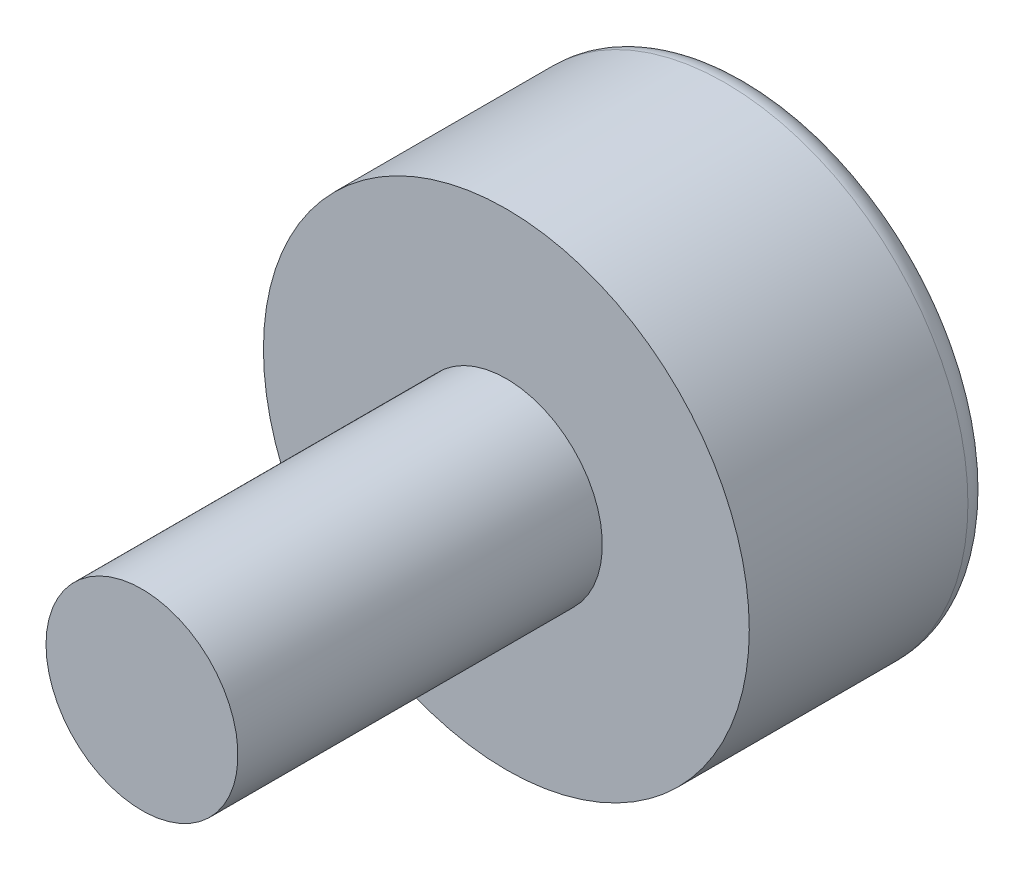
ISO-10303-21;
HEADER;
FILE_DESCRIPTION(('STEP AP214'),'2;1');
FILE_NAME('part.step','',(''),(''),'','','');
FILE_SCHEMA(('AUTOMOTIVE_DESIGN { 1 0 10303 214 1 1 1 1 }'));
ENDSEC;
DATA;
#1=APPLICATION_CONTEXT('core data for automotive mechanical design processes');
#2=APPLICATION_PROTOCOL_DEFINITION('international standard','automotive_design',2000,#1);
#3=PRODUCT_CONTEXT('',#1,'mechanical');
#4=PRODUCT('Part','Part','',(#3));
#5=PRODUCT_RELATED_PRODUCT_CATEGORY('part','',(#4));
#6=PRODUCT_DEFINITION_FORMATION('','',#4);
#7=PRODUCT_DEFINITION_CONTEXT('part definition',#1,'design');
#8=PRODUCT_DEFINITION('design','',#6,#7);
#9=PRODUCT_DEFINITION_SHAPE('','',#8);
#10=(LENGTH_UNIT() NAMED_UNIT(*) SI_UNIT(.MILLI.,.METRE.));
#11=(NAMED_UNIT(*) PLANE_ANGLE_UNIT() SI_UNIT($,.RADIAN.));
#12=(NAMED_UNIT(*) SI_UNIT($,.STERADIAN.) SOLID_ANGLE_UNIT());
#13=UNCERTAINTY_MEASURE_WITH_UNIT(LENGTH_MEASURE(1.E-05),#10,'distance_accuracy_value','');
#14=(GEOMETRIC_REPRESENTATION_CONTEXT(3) GLOBAL_UNCERTAINTY_ASSIGNED_CONTEXT((#13)) GLOBAL_UNIT_ASSIGNED_CONTEXT((#10,
#11,#12)) REPRESENTATION_CONTEXT('',''));
#15=CARTESIAN_POINT('',(0.,0.,0.));
#16=DIRECTION('',(0.,0.,1.));
#17=DIRECTION('',(1.,0.,0.));
#18=AXIS2_PLACEMENT_3D('',#15,#16,#17);
#19=CARTESIAN_POINT('',(0.,0.,2.54));
#20=DIRECTION('',(0.,0.,-1.));
#21=DIRECTION('',(-1.,0.,0.));
#22=AXIS2_PLACEMENT_3D('',#19,#20,#21);
#23=CYLINDRICAL_SURFACE('',#22,2.54);
#24=CARTESIAN_POINT('',(0.,0.,0.254));
#25=DIRECTION('',(0.,0.,1.));
#26=DIRECTION('',(1.,0.,0.));
#27=AXIS2_PLACEMENT_3D('',#24,#25,#26);
#28=CIRCLE('',#27,2.54);
#29=CARTESIAN_POINT('',(2.54,0.,0.254));
#30=VERTEX_POINT('',#29);
#31=EDGE_CURVE('E38',#30,#30,#28,.T.);
#32=ORIENTED_EDGE('',*,*,#31,.T.);
#33=EDGE_LOOP('',(#32));
#34=FACE_BOUND('',#33,.T.);
#35=CARTESIAN_POINT('',(0.,0.,2.54));
#36=DIRECTION('',(0.,0.,1.));
#37=DIRECTION('',(1.,0.,0.));
#38=AXIS2_PLACEMENT_3D('',#35,#36,#37);
#39=CIRCLE('',#38,2.54);
#40=CARTESIAN_POINT('',(2.54,0.,2.54));
#41=VERTEX_POINT('',#40);
#42=EDGE_CURVE('E42',#41,#41,#39,.T.);
#43=ORIENTED_EDGE('',*,*,#42,.F.);
#44=EDGE_LOOP('',(#43));
#45=FACE_BOUND('',#44,.T.);
#46=ADVANCED_FACE('F31',(#34,#45),#23,.T.);
#47=CARTESIAN_POINT('',(0.,0.,2.54));
#48=DIRECTION('',(0.,0.,1.));
#49=DIRECTION('',(1.,0.,0.));
#50=AXIS2_PLACEMENT_3D('',#47,#48,#49);
#51=PLANE('',#50);
#52=CARTESIAN_POINT('',(0.,0.,2.54));
#53=DIRECTION('',(0.,0.,1.));
#54=DIRECTION('',(1.,0.,0.));
#55=AXIS2_PLACEMENT_3D('',#52,#53,#54);
#56=CIRCLE('',#55,1.0033);
#57=CARTESIAN_POINT('',(-1.0033,0.,2.54));
#58=VERTEX_POINT('',#57);
#59=EDGE_CURVE('E49',#58,#58,#56,.T.);
#60=ORIENTED_EDGE('',*,*,#59,.F.);
#61=EDGE_LOOP('',(#60));
#62=FACE_BOUND('',#61,.T.);
#63=ORIENTED_EDGE('',*,*,#42,.T.);
#64=EDGE_LOOP('',(#63));
#65=FACE_BOUND('',#64,.T.);
#66=ADVANCED_FACE('F64',(#62,#65),#51,.T.);
#67=CARTESIAN_POINT('',(0.,0.,0.));
#68=DIRECTION('',(0.,0.,1.));
#69=DIRECTION('',(1.,0.,0.));
#70=AXIS2_PLACEMENT_3D('',#67,#68,#69);
#71=PLANE('',#70);
#72=CARTESIAN_POINT('',(0.,0.,0.));
#73=DIRECTION('',(0.,0.,1.));
#74=DIRECTION('',(1.,0.,0.));
#75=AXIS2_PLACEMENT_3D('',#72,#73,#74);
#76=CIRCLE('',#75,2.286);
#77=CARTESIAN_POINT('',(2.286,0.,0.));
#78=VERTEX_POINT('',#77);
#79=EDGE_CURVE('E10',#78,#78,#76,.F.);
#80=ORIENTED_EDGE('',*,*,#79,.T.);
#81=EDGE_LOOP('',(#80));
#82=FACE_BOUND('',#81,.T.);
#83=ADVANCED_FACE('F60',(#82),#71,.F.);
#84=CARTESIAN_POINT('',(0.,0.,6.35));
#85=DIRECTION('',(0.,0.,-1.));
#86=DIRECTION('',(-1.,0.,0.));
#87=AXIS2_PLACEMENT_3D('',#84,#85,#86);
#88=CYLINDRICAL_SURFACE('',#87,1.0033);
#89=CARTESIAN_POINT('',(0.,0.,6.35));
#90=DIRECTION('',(0.,0.,1.));
#91=DIRECTION('',(1.,0.,0.));
#92=AXIS2_PLACEMENT_3D('',#89,#90,#91);
#93=CIRCLE('',#92,1.0033);
#94=CARTESIAN_POINT('',(-1.0033,0.,6.35));
#95=VERTEX_POINT('',#94);
#96=EDGE_CURVE('E46',#95,#95,#93,.T.);
#97=CARTESIAN_POINT('',(-1.0033,0.,6.35));
#98=CARTESIAN_POINT('',(-1.0033,0.,6.3103125));
#99=CARTESIAN_POINT('',(-1.0033,0.,6.270625));
#100=CARTESIAN_POINT('',(-1.0033,0.,6.19125));
#101=CARTESIAN_POINT('',(-1.0033,0.,6.1515625));
#102=CARTESIAN_POINT('',(-1.0033,0.,6.0721875));
#103=CARTESIAN_POINT('',(-1.0033,0.,6.0325));
#104=CARTESIAN_POINT('',(-1.0033,0.,5.953125));
#105=CARTESIAN_POINT('',(-1.0033,0.,5.9134375));
#106=CARTESIAN_POINT('',(-1.0033,0.,5.8340625));
#107=CARTESIAN_POINT('',(-1.0033,0.,5.794375));
#108=CARTESIAN_POINT('',(-1.0033,0.,5.715));
#109=CARTESIAN_POINT('',(-1.0033,0.,5.6753125));
#110=CARTESIAN_POINT('',(-1.0033,0.,5.5959375));
#111=CARTESIAN_POINT('',(-1.0033,0.,5.55625));
#112=CARTESIAN_POINT('',(-1.0033,0.,5.476875));
#113=CARTESIAN_POINT('',(-1.0033,0.,5.4371875));
#114=CARTESIAN_POINT('',(-1.0033,0.,5.3578125));
#115=CARTESIAN_POINT('',(-1.0033,0.,5.318125));
#116=CARTESIAN_POINT('',(-1.0033,0.,5.23875));
#117=CARTESIAN_POINT('',(-1.0033,0.,5.1990625));
#118=CARTESIAN_POINT('',(-1.0033,0.,5.1196875));
#119=CARTESIAN_POINT('',(-1.0033,0.,5.08));
#120=CARTESIAN_POINT('',(-1.0033,0.,5.000625));
#121=CARTESIAN_POINT('',(-1.0033,0.,4.9609375));
#122=CARTESIAN_POINT('',(-1.0033,0.,4.8815625));
#123=CARTESIAN_POINT('',(-1.0033,0.,4.841875));
#124=CARTESIAN_POINT('',(-1.0033,0.,4.7625));
#125=CARTESIAN_POINT('',(-1.0033,0.,4.7228125));
#126=CARTESIAN_POINT('',(-1.0033,0.,4.6434375));
#127=CARTESIAN_POINT('',(-1.0033,0.,4.60375));
#128=CARTESIAN_POINT('',(-1.0033,0.,4.524375));
#129=CARTESIAN_POINT('',(-1.0033,0.,4.4846875));
#130=CARTESIAN_POINT('',(-1.0033,0.,4.4053125));
#131=CARTESIAN_POINT('',(-1.0033,0.,4.365625));
#132=CARTESIAN_POINT('',(-1.0033,0.,4.28625));
#133=CARTESIAN_POINT('',(-1.0033,0.,4.2465625));
#134=CARTESIAN_POINT('',(-1.0033,0.,4.1671875));
#135=CARTESIAN_POINT('',(-1.0033,0.,4.1275));
#136=CARTESIAN_POINT('',(-1.0033,0.,4.048125));
#137=CARTESIAN_POINT('',(-1.0033,0.,4.0084375));
#138=CARTESIAN_POINT('',(-1.0033,0.,3.9290625));
#139=CARTESIAN_POINT('',(-1.0033,0.,3.889375));
#140=CARTESIAN_POINT('',(-1.0033,0.,3.81));
#141=CARTESIAN_POINT('',(-1.0033,0.,3.7703125));
#142=CARTESIAN_POINT('',(-1.0033,0.,3.6909375));
#143=CARTESIAN_POINT('',(-1.0033,0.,3.65125));
#144=CARTESIAN_POINT('',(-1.0033,0.,3.571875));
#145=CARTESIAN_POINT('',(-1.0033,0.,3.5321875));
#146=CARTESIAN_POINT('',(-1.0033,0.,3.4528125));
#147=CARTESIAN_POINT('',(-1.0033,0.,3.413125));
#148=CARTESIAN_POINT('',(-1.0033,0.,3.33375));
#149=CARTESIAN_POINT('',(-1.0033,0.,3.2940625));
#150=CARTESIAN_POINT('',(-1.0033,0.,3.2146875));
#151=CARTESIAN_POINT('',(-1.0033,0.,3.175));
#152=CARTESIAN_POINT('',(-1.0033,0.,3.095625));
#153=CARTESIAN_POINT('',(-1.0033,0.,3.0559375));
#154=CARTESIAN_POINT('',(-1.0033,0.,2.9765625));
#155=CARTESIAN_POINT('',(-1.0033,0.,2.936875));
#156=CARTESIAN_POINT('',(-1.0033,0.,2.8575));
#157=CARTESIAN_POINT('',(-1.0033,0.,2.8178125));
#158=CARTESIAN_POINT('',(-1.0033,0.,2.7384375));
#159=CARTESIAN_POINT('',(-1.0033,0.,2.69875));
#160=CARTESIAN_POINT('',(-1.0033,0.,2.619375));
#161=CARTESIAN_POINT('',(-1.0033,0.,2.5796875));
#162=CARTESIAN_POINT('',(-1.0033,0.,2.54));
#163=B_SPLINE_CURVE_WITH_KNOTS('',3,(#97,#98,#99,#100,#101,#102,#103,#104,#105,#106,#107,#108,
#109,#110,#111,#112,#113,#114,#115,#116,#117,#118,#119,#120,#121,#122,#123,#124,#125,#126,#127,
#128,#129,#130,#131,#132,#133,#134,#135,#136,#137,#138,#139,#140,#141,#142,#143,#144,#145,#146,
#147,#148,#149,#150,#151,#152,#153,#154,#155,#156,#157,#158,#159,#160,#161,#162),.UNSPECIFIED.,
.F.,.F.,(4,2,2,2,2,2,2,2,2,2,2,2,2,2,2,2,2,2,2,2,2,2,2,2,2,2,2,2,2,2,2,2,4),(0.,
0.119062499999999,0.238125,0.3571875,0.476249999999999,0.595312499999999,0.714375,
0.833437499999999,0.952499999999999,1.0715625,1.190625,1.3096875,1.42875,1.5478125,1.666875,
1.7859375,1.905,2.0240625,2.143125,2.2621875,2.38125,2.5003125,2.619375,2.7384375,2.8575,
2.9765625,3.095625,3.2146875,3.33375,3.4528125,3.571875,3.6909375,3.81),.UNSPECIFIED.);
#164=EDGE_CURVE('BSEAM57',#95,#58,#163,.T.);
#165=ORIENTED_EDGE('',*,*,#96,.F.);
#166=ORIENTED_EDGE('',*,*,#59,.T.);
#167=ORIENTED_EDGE('',*,*,#164,.T.);
#168=ORIENTED_EDGE('',*,*,#164,.F.);
#169=EDGE_LOOP('',(#165,#167,#166,#168));
#170=FACE_BOUND('',#169,.T.);
#171=ADVANCED_FACE('F57',(#170),#88,.T.);
#172=CARTESIAN_POINT('',(0.,0.,6.35));
#173=DIRECTION('',(0.,0.,1.));
#174=DIRECTION('',(1.,0.,0.));
#175=AXIS2_PLACEMENT_3D('',#172,#173,#174);
#176=PLANE('',#175);
#177=ORIENTED_EDGE('',*,*,#96,.T.);
#178=EDGE_LOOP('',(#177));
#179=FACE_BOUND('',#178,.T.);
#180=ADVANCED_FACE('F55',(#179),#176,.T.);
#181=CARTESIAN_POINT('',(0.,0.,0.254));
#182=DIRECTION('',(0.,0.,1.));
#183=DIRECTION('',(1.,0.,0.));
#184=AXIS2_PLACEMENT_3D('',#181,#182,#183);
#185=TOROIDAL_SURFACE('',#184,2.286,0.254);
#186=ORIENTED_EDGE('',*,*,#79,.F.);
#187=EDGE_LOOP('',(#186));
#188=FACE_BOUND('',#187,.T.);
#189=ORIENTED_EDGE('',*,*,#31,.F.);
#190=EDGE_LOOP('',(#189));
#191=FACE_BOUND('',#190,.T.);
#192=ADVANCED_FACE('F33',(#188,#191),#185,.T.);
#193=CLOSED_SHELL('',(#46,#66,#83,#171,#180,#192));
#194=MANIFOLD_SOLID_BREP('B2',#193);
#195=ADVANCED_BREP_SHAPE_REPRESENTATION('',(#18,#194),#14);
#196=SHAPE_DEFINITION_REPRESENTATION(#9,#195);
ENDSEC;
END-ISO-10303-21;
